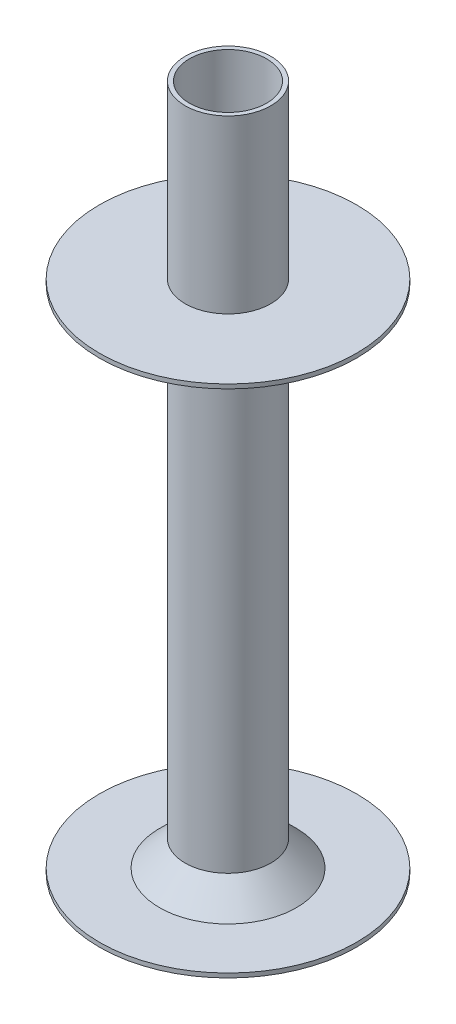
ISO-10303-21;
HEADER;
FILE_DESCRIPTION(('STEP AP214'),'2;1');
FILE_NAME('part.step','',(''),(''),'','','');
FILE_SCHEMA(('AUTOMOTIVE_DESIGN { 1 0 10303 214 1 1 1 1 }'));
ENDSEC;
DATA;
#1=APPLICATION_CONTEXT('core data for automotive mechanical design processes');
#2=APPLICATION_PROTOCOL_DEFINITION('international standard','automotive_design',2000,#1);
#3=PRODUCT_CONTEXT('',#1,'mechanical');
#4=PRODUCT('Part','Part','',(#3));
#5=PRODUCT_RELATED_PRODUCT_CATEGORY('part','',(#4));
#6=PRODUCT_DEFINITION_FORMATION('','',#4);
#7=PRODUCT_DEFINITION_CONTEXT('part definition',#1,'design');
#8=PRODUCT_DEFINITION('design','',#6,#7);
#9=PRODUCT_DEFINITION_SHAPE('','',#8);
#10=(LENGTH_UNIT() NAMED_UNIT(*) SI_UNIT(.MILLI.,.METRE.));
#11=(NAMED_UNIT(*) PLANE_ANGLE_UNIT() SI_UNIT($,.RADIAN.));
#12=(NAMED_UNIT(*) SI_UNIT($,.STERADIAN.) SOLID_ANGLE_UNIT());
#13=UNCERTAINTY_MEASURE_WITH_UNIT(LENGTH_MEASURE(1.E-05),#10,'distance_accuracy_value','');
#14=(GEOMETRIC_REPRESENTATION_CONTEXT(3) GLOBAL_UNCERTAINTY_ASSIGNED_CONTEXT((#13)) GLOBAL_UNIT_ASSIGNED_CONTEXT((#10,
#11,#12)) REPRESENTATION_CONTEXT('',''));
#15=CARTESIAN_POINT('',(0.,0.,0.));
#16=DIRECTION('',(0.,0.,1.));
#17=DIRECTION('',(1.,0.,0.));
#18=AXIS2_PLACEMENT_3D('',#15,#16,#17);
#19=CARTESIAN_POINT('',(0.,800.,0.));
#20=DIRECTION('',(0.,-1.,0.));
#21=DIRECTION('',(0.,0.,-1.));
#22=AXIS2_PLACEMENT_3D('',#19,#20,#21);
#23=CYLINDRICAL_SURFACE('',#22,50.);
#24=CARTESIAN_POINT('',(0.,565.,0.));
#25=DIRECTION('',(0.,1.,0.));
#26=DIRECTION('',(0.,0.,1.));
#27=AXIS2_PLACEMENT_3D('',#24,#25,#26);
#28=CIRCLE('',#27,50.);
#29=CARTESIAN_POINT('',(0.,565.,50.));
#30=VERTEX_POINT('',#29);
#31=EDGE_CURVE('E54',#30,#30,#28,.F.);
#32=ORIENTED_EDGE('',*,*,#31,.T.);
#33=EDGE_LOOP('',(#32));
#34=FACE_BOUND('',#33,.T.);
#35=CARTESIAN_POINT('',(0.,35.0000000000003,0.));
#36=DIRECTION('',(0.,-1.,0.));
#37=DIRECTION('',(0.,0.,-1.));
#38=AXIS2_PLACEMENT_3D('',#35,#36,#37);
#39=CIRCLE('',#38,50.);
#40=CARTESIAN_POINT('',(0.,35.0000000000003,-50.));
#41=VERTEX_POINT('',#40);
#42=EDGE_CURVE('E44',#41,#41,#39,.F.);
#43=ORIENTED_EDGE('',*,*,#42,.T.);
#44=EDGE_LOOP('',(#43));
#45=FACE_BOUND('',#44,.T.);
#46=ADVANCED_FACE('F36',(#34,#45),#23,.T.);
#47=CARTESIAN_POINT('',(0.,4.99999999999999,0.));
#48=DIRECTION('',(0.,-1.,0.));
#49=DIRECTION('',(0.,0.,-1.));
#50=AXIS2_PLACEMENT_3D('',#47,#48,#49);
#51=CONICAL_SURFACE('',#50,80.,0.785398163397443);
#52=CARTESIAN_POINT('',(0.,4.99999999999999,0.));
#53=DIRECTION('',(0.,-1.,0.));
#54=DIRECTION('',(0.,0.,-1.));
#55=AXIS2_PLACEMENT_3D('',#52,#53,#54);
#56=CIRCLE('',#55,80.);
#57=CARTESIAN_POINT('',(0.,4.99999999999999,-80.));
#58=VERTEX_POINT('',#57);
#59=EDGE_CURVE('E63',#58,#58,#56,.T.);
#60=ORIENTED_EDGE('',*,*,#59,.F.);
#61=EDGE_LOOP('',(#60));
#62=FACE_BOUND('',#61,.T.);
#63=ORIENTED_EDGE('',*,*,#42,.F.);
#64=EDGE_LOOP('',(#63));
#65=FACE_BOUND('',#64,.T.);
#66=ADVANCED_FACE('F91',(#62,#65),#51,.T.);
#67=CARTESIAN_POINT('',(0.,-31.1699157863465,0.));
#68=DIRECTION('',(0.,-1.,0.));
#69=DIRECTION('',(0.,0.,-1.));
#70=AXIS2_PLACEMENT_3D('',#67,#68,#69);
#71=CYLINDRICAL_SURFACE('',#70,150.);
#72=CARTESIAN_POINT('',(0.,5.,0.));
#73=DIRECTION('',(0.,-1.,0.));
#74=DIRECTION('',(0.,0.,-1.));
#75=AXIS2_PLACEMENT_3D('',#72,#73,#74);
#76=CIRCLE('',#75,150.);
#77=CARTESIAN_POINT('',(0.,5.,-150.));
#78=VERTEX_POINT('',#77);
#79=EDGE_CURVE('E77',#78,#78,#76,.T.);
#80=ORIENTED_EDGE('',*,*,#79,.T.);
#81=EDGE_LOOP('',(#80));
#82=FACE_BOUND('',#81,.T.);
#83=CARTESIAN_POINT('',(0.,0.,0.));
#84=DIRECTION('',(0.,-1.,0.));
#85=DIRECTION('',(0.,0.,-1.));
#86=AXIS2_PLACEMENT_3D('',#83,#84,#85);
#87=CIRCLE('',#86,150.);
#88=CARTESIAN_POINT('',(0.,0.,-150.));
#89=VERTEX_POINT('',#88);
#90=EDGE_CURVE('E50',#89,#89,#87,.T.);
#91=ORIENTED_EDGE('',*,*,#90,.F.);
#92=EDGE_LOOP('',(#91));
#93=FACE_BOUND('',#92,.T.);
#94=ADVANCED_FACE('F88',(#82,#93),#71,.T.);
#95=CARTESIAN_POINT('',(150.,5.,0.));
#96=DIRECTION('',(0.,1.,0.));
#97=DIRECTION('',(0.,0.,1.));
#98=AXIS2_PLACEMENT_3D('',#95,#96,#97);
#99=PLANE('',#98);
#100=ORIENTED_EDGE('',*,*,#59,.T.);
#101=EDGE_LOOP('',(#100));
#102=FACE_BOUND('',#101,.T.);
#103=ORIENTED_EDGE('',*,*,#79,.F.);
#104=EDGE_LOOP('',(#103));
#105=FACE_BOUND('',#104,.T.);
#106=ADVANCED_FACE('F90',(#102,#105),#99,.T.);
#107=CARTESIAN_POINT('',(0.,0.,0.));
#108=DIRECTION('',(0.,1.,0.));
#109=DIRECTION('',(0.,0.,1.));
#110=AXIS2_PLACEMENT_3D('',#107,#108,#109);
#111=PLANE('',#110);
#112=CARTESIAN_POINT('',(0.,0.,0.));
#113=DIRECTION('',(0.,1.,0.));
#114=DIRECTION('',(0.,0.,1.));
#115=AXIS2_PLACEMENT_3D('',#112,#113,#114);
#116=CIRCLE('',#115,45.);
#117=CARTESIAN_POINT('',(0.,0.,45.));
#118=VERTEX_POINT('',#117);
#119=EDGE_CURVE('E146',#118,#118,#116,.T.);
#120=ORIENTED_EDGE('',*,*,#119,.T.);
#121=EDGE_LOOP('',(#120));
#122=FACE_BOUND('',#121,.T.);
#123=ORIENTED_EDGE('',*,*,#90,.T.);
#124=EDGE_LOOP('',(#123));
#125=FACE_BOUND('',#124,.T.);
#126=ADVANCED_FACE('F86',(#122,#125),#111,.F.);
#127=CARTESIAN_POINT('',(0.,514.999999999999,0.));
#128=DIRECTION('',(0.,1.,0.));
#129=DIRECTION('',(0.,0.,1.));
#130=AXIS2_PLACEMENT_3D('',#127,#128,#129);
#131=CONICAL_SURFACE('',#130,0.,0.785398163397443);
#132=CARTESIAN_POINT('',(0.,595.,0.));
#133=DIRECTION('',(0.,-1.,0.));
#134=DIRECTION('',(0.,0.,-1.));
#135=AXIS2_PLACEMENT_3D('',#132,#133,#134);
#136=CIRCLE('',#135,80.);
#137=CARTESIAN_POINT('',(0.,595.,-80.));
#138=VERTEX_POINT('',#137);
#139=EDGE_CURVE('E71',#138,#138,#136,.T.);
#140=ORIENTED_EDGE('',*,*,#139,.T.);
#141=EDGE_LOOP('',(#140));
#142=FACE_BOUND('',#141,.T.);
#143=ORIENTED_EDGE('',*,*,#31,.F.);
#144=EDGE_LOOP('',(#143));
#145=FACE_BOUND('',#144,.T.);
#146=ADVANCED_FACE('F127',(#142,#145),#131,.T.);
#147=CARTESIAN_POINT('',(0.,600.,0.));
#148=DIRECTION('',(0.,1.,0.));
#149=DIRECTION('',(0.,0.,1.));
#150=AXIS2_PLACEMENT_3D('',#147,#148,#149);
#151=PLANE('',#150);
#152=CARTESIAN_POINT('',(0.,600.,0.));
#153=DIRECTION('',(0.,1.,0.));
#154=DIRECTION('',(0.,0.,1.));
#155=AXIS2_PLACEMENT_3D('',#152,#153,#154);
#156=CIRCLE('',#155,50.);
#157=CARTESIAN_POINT('',(0.,600.,50.));
#158=VERTEX_POINT('',#157);
#159=EDGE_CURVE('E39',#158,#158,#156,.T.);
#160=ORIENTED_EDGE('',*,*,#159,.F.);
#161=EDGE_LOOP('',(#160));
#162=FACE_BOUND('',#161,.T.);
#163=CARTESIAN_POINT('',(0.,600.,0.));
#164=DIRECTION('',(0.,-1.,0.));
#165=DIRECTION('',(0.,0.,-1.));
#166=AXIS2_PLACEMENT_3D('',#163,#164,#165);
#167=CIRCLE('',#166,150.);
#168=CARTESIAN_POINT('',(0.,600.,-150.));
#169=VERTEX_POINT('',#168);
#170=EDGE_CURVE('E57',#169,#169,#167,.T.);
#171=ORIENTED_EDGE('',*,*,#170,.F.);
#172=EDGE_LOOP('',(#171));
#173=FACE_BOUND('',#172,.T.);
#174=ADVANCED_FACE('F123',(#162,#173),#151,.T.);
#175=CARTESIAN_POINT('',(0.,-31.1699157863465,0.));
#176=DIRECTION('',(0.,-1.,0.));
#177=DIRECTION('',(0.,0.,-1.));
#178=AXIS2_PLACEMENT_3D('',#175,#176,#177);
#179=CYLINDRICAL_SURFACE('',#178,150.);
#180=ORIENTED_EDGE('',*,*,#170,.T.);
#181=EDGE_LOOP('',(#180));
#182=FACE_BOUND('',#181,.T.);
#183=CARTESIAN_POINT('',(0.,595.,0.));
#184=DIRECTION('',(0.,-1.,0.));
#185=DIRECTION('',(0.,0.,-1.));
#186=AXIS2_PLACEMENT_3D('',#183,#184,#185);
#187=CIRCLE('',#186,150.);
#188=CARTESIAN_POINT('',(0.,595.,-150.));
#189=VERTEX_POINT('',#188);
#190=EDGE_CURVE('E65',#189,#189,#187,.T.);
#191=ORIENTED_EDGE('',*,*,#190,.F.);
#192=EDGE_LOOP('',(#191));
#193=FACE_BOUND('',#192,.T.);
#194=ADVANCED_FACE('F126',(#182,#193),#179,.T.);
#195=CARTESIAN_POINT('',(150.,595.,0.));
#196=DIRECTION('',(0.,-1.,0.));
#197=DIRECTION('',(0.,0.,-1.));
#198=AXIS2_PLACEMENT_3D('',#195,#196,#197);
#199=PLANE('',#198);
#200=ORIENTED_EDGE('',*,*,#190,.T.);
#201=EDGE_LOOP('',(#200));
#202=FACE_BOUND('',#201,.T.);
#203=ORIENTED_EDGE('',*,*,#139,.F.);
#204=EDGE_LOOP('',(#203));
#205=FACE_BOUND('',#204,.T.);
#206=ADVANCED_FACE('F118',(#202,#205),#199,.T.);
#207=CARTESIAN_POINT('',(0.,800.,0.));
#208=DIRECTION('',(0.,1.,0.));
#209=DIRECTION('',(0.,0.,1.));
#210=AXIS2_PLACEMENT_3D('',#207,#208,#209);
#211=PLANE('',#210);
#212=CARTESIAN_POINT('',(0.,800.,0.));
#213=DIRECTION('',(0.,1.,0.));
#214=DIRECTION('',(0.,0.,1.));
#215=AXIS2_PLACEMENT_3D('',#212,#213,#214);
#216=CIRCLE('',#215,45.);
#217=CARTESIAN_POINT('',(0.,800.,45.));
#218=VERTEX_POINT('',#217);
#219=EDGE_CURVE('E149',#218,#218,#216,.T.);
#220=ORIENTED_EDGE('',*,*,#219,.F.);
#221=EDGE_LOOP('',(#220));
#222=FACE_BOUND('',#221,.T.);
#223=CARTESIAN_POINT('',(0.,800.,0.));
#224=DIRECTION('',(0.,1.,0.));
#225=DIRECTION('',(0.,0.,1.));
#226=AXIS2_PLACEMENT_3D('',#223,#224,#225);
#227=CIRCLE('',#226,50.);
#228=CARTESIAN_POINT('',(0.,800.,50.));
#229=VERTEX_POINT('',#228);
#230=EDGE_CURVE('E10',#229,#229,#227,.T.);
#231=ORIENTED_EDGE('',*,*,#230,.T.);
#232=EDGE_LOOP('',(#231));
#233=FACE_BOUND('',#232,.T.);
#234=ADVANCED_FACE('F109',(#222,#233),#211,.T.);
#235=ORIENTED_EDGE('',*,*,#159,.T.);
#236=EDGE_LOOP('',(#235));
#237=FACE_BOUND('',#236,.T.);
#238=ORIENTED_EDGE('',*,*,#230,.F.);
#239=EDGE_LOOP('',(#238));
#240=FACE_BOUND('',#239,.T.);
#241=ADVANCED_FACE('F103',(#237,#240),#23,.T.);
#242=CARTESIAN_POINT('',(0.,0.,0.));
#243=DIRECTION('',(0.,1.,0.));
#244=DIRECTION('',(0.,0.,1.));
#245=AXIS2_PLACEMENT_3D('',#242,#243,#244);
#246=CYLINDRICAL_SURFACE('',#245,45.);
#247=ORIENTED_EDGE('',*,*,#119,.F.);
#248=EDGE_LOOP('',(#247));
#249=FACE_BOUND('',#248,.T.);
#250=ORIENTED_EDGE('',*,*,#219,.T.);
#251=EDGE_LOOP('',(#250));
#252=FACE_BOUND('',#251,.T.);
#253=ADVANCED_FACE('F108',(#249,#252),#246,.F.);
#254=CLOSED_SHELL('',(#46,#66,#94,#106,#126,#146,#174,#194,#206,#234,#241,#253));
#255=MANIFOLD_SOLID_BREP('B2',#254);
#256=ADVANCED_BREP_SHAPE_REPRESENTATION('',(#18,#255),#14);
#257=SHAPE_DEFINITION_REPRESENTATION(#9,#256);
ENDSEC;
END-ISO-10303-21;
